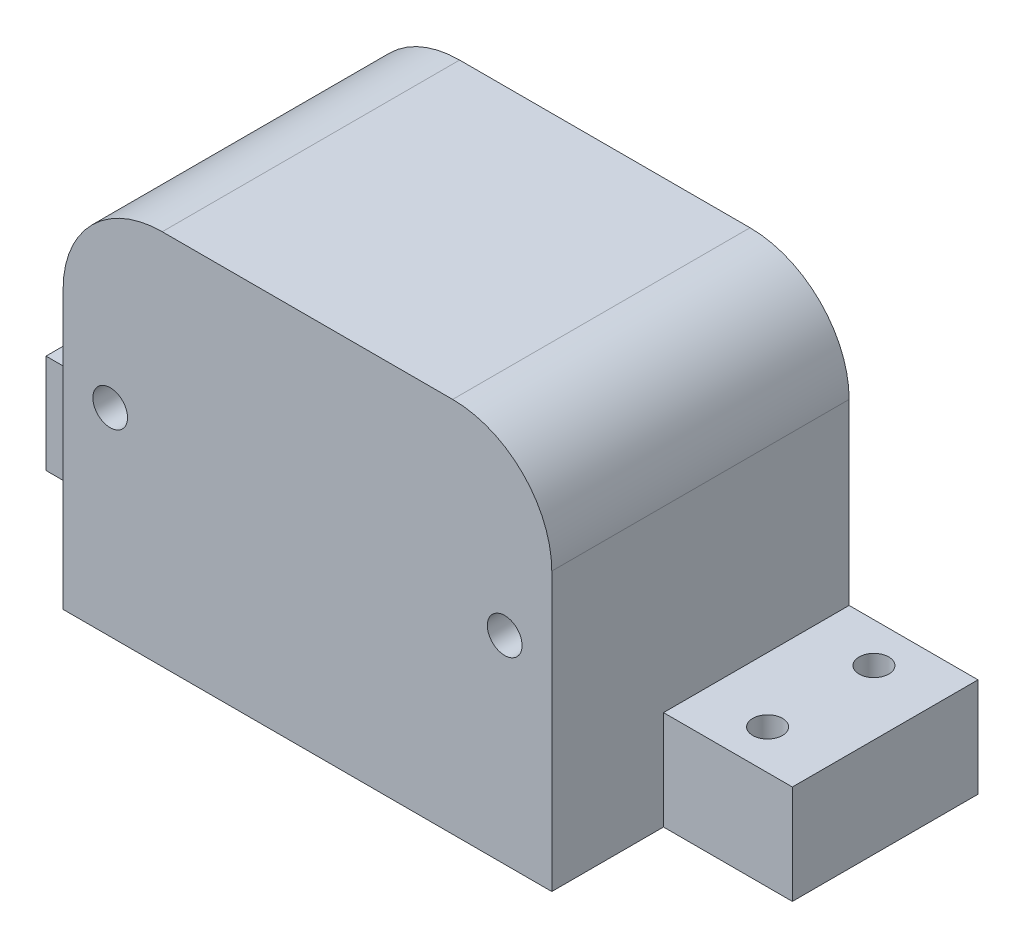
ISO-10303-21;
HEADER;
FILE_DESCRIPTION(('STEP AP214'),'2;1');
FILE_NAME('part.step','',(''),(''),'','','');
FILE_SCHEMA(('AUTOMOTIVE_DESIGN { 1 0 10303 214 1 1 1 1 }'));
ENDSEC;
DATA;
#1=APPLICATION_CONTEXT('core data for automotive mechanical design processes');
#2=APPLICATION_PROTOCOL_DEFINITION('international standard','automotive_design',2000,#1);
#3=PRODUCT_CONTEXT('',#1,'mechanical');
#4=PRODUCT('Part','Part','',(#3));
#5=PRODUCT_RELATED_PRODUCT_CATEGORY('part','',(#4));
#6=PRODUCT_DEFINITION_FORMATION('','',#4);
#7=PRODUCT_DEFINITION_CONTEXT('part definition',#1,'design');
#8=PRODUCT_DEFINITION('design','',#6,#7);
#9=PRODUCT_DEFINITION_SHAPE('','',#8);
#10=(LENGTH_UNIT() NAMED_UNIT(*) SI_UNIT(.MILLI.,.METRE.));
#11=(NAMED_UNIT(*) PLANE_ANGLE_UNIT() SI_UNIT($,.RADIAN.));
#12=(NAMED_UNIT(*) SI_UNIT($,.STERADIAN.) SOLID_ANGLE_UNIT());
#13=UNCERTAINTY_MEASURE_WITH_UNIT(LENGTH_MEASURE(1.E-05),#10,'distance_accuracy_value','');
#14=(GEOMETRIC_REPRESENTATION_CONTEXT(3) GLOBAL_UNCERTAINTY_ASSIGNED_CONTEXT((#13)) GLOBAL_UNIT_ASSIGNED_CONTEXT((#10,
#11,#12)) REPRESENTATION_CONTEXT('',''));
#15=CARTESIAN_POINT('',(0.,0.,0.));
#16=DIRECTION('',(0.,0.,1.));
#17=DIRECTION('',(1.,0.,0.));
#18=AXIS2_PLACEMENT_3D('',#15,#16,#17);
#19=CARTESIAN_POINT('',(0.,-19.,30.));
#20=DIRECTION('',(0.,1.,0.));
#21=DIRECTION('',(0.,0.,1.));
#22=AXIS2_PLACEMENT_3D('',#19,#20,#21);
#23=PLANE('',#22);
#24=CARTESIAN_POINT('',(31.15,-19.,3.99999999999999));
#25=DIRECTION('',(0.,1.,0.));
#26=DIRECTION('',(0.,0.,1.));
#27=AXIS2_PLACEMENT_3D('',#24,#25,#26);
#28=CIRCLE('',#27,1.49999999999999);
#29=CARTESIAN_POINT('',(31.15,-19.,5.49999999999998));
#30=VERTEX_POINT('',#29);
#31=EDGE_CURVE('E243',#30,#30,#28,.T.);
#32=ORIENTED_EDGE('',*,*,#31,.T.);
#33=EDGE_LOOP('',(#32));
#34=FACE_BOUND('',#33,.T.);
#35=CARTESIAN_POINT('',(31.15,-19.,14.7279854884588));
#36=DIRECTION('',(0.,1.,0.));
#37=DIRECTION('',(0.,0.,1.));
#38=AXIS2_PLACEMENT_3D('',#35,#36,#37);
#39=CIRCLE('',#38,1.5);
#40=CARTESIAN_POINT('',(31.15,-19.,16.2279854884588));
#41=VERTEX_POINT('',#40);
#42=EDGE_CURVE('E256',#41,#41,#39,.T.);
#43=ORIENTED_EDGE('',*,*,#42,.T.);
#44=EDGE_LOOP('',(#43));
#45=FACE_BOUND('',#44,.T.);
#46=CARTESIAN_POINT('',(-31.15,-19.,14.7279854884588));
#47=DIRECTION('',(0.,1.,0.));
#48=DIRECTION('',(0.,0.,1.));
#49=AXIS2_PLACEMENT_3D('',#46,#47,#48);
#50=CIRCLE('',#49,1.5);
#51=CARTESIAN_POINT('',(-31.15,-19.,16.2279854884588));
#52=VERTEX_POINT('',#51);
#53=EDGE_CURVE('E259',#52,#52,#50,.T.);
#54=ORIENTED_EDGE('',*,*,#53,.T.);
#55=EDGE_LOOP('',(#54));
#56=FACE_BOUND('',#55,.T.);
#57=CARTESIAN_POINT('',(-31.15,-19.,4.));
#58=DIRECTION('',(0.,1.,0.));
#59=DIRECTION('',(0.,0.,1.));
#60=AXIS2_PLACEMENT_3D('',#57,#58,#59);
#61=CIRCLE('',#60,1.5);
#62=CARTESIAN_POINT('',(-31.15,-19.,5.5));
#63=VERTEX_POINT('',#62);
#64=EDGE_CURVE('E262',#63,#63,#61,.T.);
#65=ORIENTED_EDGE('',*,*,#64,.T.);
#66=EDGE_LOOP('',(#65));
#67=FACE_BOUND('',#66,.T.);
#68=DIRECTION('',(-1.,0.,0.));
#69=VECTOR('',#68,1.);
#70=CARTESIAN_POINT('',(0.,-19.,18.7279854884588));
#71=LINE('',#70,#69);
#72=CARTESIAN_POINT('',(37.65,-19.,18.7279854884588));
#73=VERTEX_POINT('',#72);
#74=CARTESIAN_POINT('',(24.65,-19.,18.7279854884588));
#75=VERTEX_POINT('',#74);
#76=EDGE_CURVE('E241',#73,#75,#71,.T.);
#77=ORIENTED_EDGE('',*,*,#76,.T.);
#78=DIRECTION('',(0.,0.,1.));
#79=VECTOR('',#78,1.);
#80=CARTESIAN_POINT('',(24.65,-19.,30.));
#81=LINE('',#80,#79);
#82=CARTESIAN_POINT('',(24.65,-19.,30.));
#83=VERTEX_POINT('',#82);
#84=EDGE_CURVE('E136',#75,#83,#81,.T.);
#85=ORIENTED_EDGE('',*,*,#84,.T.);
#86=DIRECTION('',(1.,0.,0.));
#87=VECTOR('',#86,1.);
#88=CARTESIAN_POINT('',(0.,-19.,30.));
#89=LINE('',#88,#87);
#90=CARTESIAN_POINT('',(-24.65,-19.,30.));
#91=VERTEX_POINT('',#90);
#92=EDGE_CURVE('E218',#91,#83,#89,.T.);
#93=ORIENTED_EDGE('',*,*,#92,.F.);
#94=DIRECTION('',(0.,0.,-1.));
#95=VECTOR('',#94,1.);
#96=CARTESIAN_POINT('',(-24.65,-19.,30.));
#97=LINE('',#96,#95);
#98=CARTESIAN_POINT('',(-24.65,-19.,18.7279854884588));
#99=VERTEX_POINT('',#98);
#100=EDGE_CURVE('E269',#91,#99,#97,.T.);
#101=ORIENTED_EDGE('',*,*,#100,.T.);
#102=DIRECTION('',(-1.,0.,0.));
#103=VECTOR('',#102,1.);
#104=CARTESIAN_POINT('',(0.,-19.,18.7279854884588));
#105=LINE('',#104,#103);
#106=CARTESIAN_POINT('',(-37.65,-19.,18.7279854884588));
#107=VERTEX_POINT('',#106);
#108=EDGE_CURVE('E265',#99,#107,#105,.T.);
#109=ORIENTED_EDGE('',*,*,#108,.T.);
#110=DIRECTION('',(0.,0.,-1.));
#111=VECTOR('',#110,1.);
#112=CARTESIAN_POINT('',(-37.65,-19.,30.));
#113=LINE('',#112,#111);
#114=CARTESIAN_POINT('',(-37.65,-19.,0.));
#115=VERTEX_POINT('',#114);
#116=EDGE_CURVE('E219',#107,#115,#113,.T.);
#117=ORIENTED_EDGE('',*,*,#116,.T.);
#118=DIRECTION('',(1.,0.,0.));
#119=VECTOR('',#118,1.);
#120=CARTESIAN_POINT('',(0.,-19.,0.));
#121=LINE('',#120,#119);
#122=CARTESIAN_POINT('',(37.65,-19.,0.));
#123=VERTEX_POINT('',#122);
#124=EDGE_CURVE('E237',#115,#123,#121,.T.);
#125=ORIENTED_EDGE('',*,*,#124,.T.);
#126=DIRECTION('',(0.,0.,-1.));
#127=VECTOR('',#126,1.);
#128=CARTESIAN_POINT('',(37.65,-19.,30.));
#129=LINE('',#128,#127);
#130=EDGE_CURVE('E157',#73,#123,#129,.T.);
#131=ORIENTED_EDGE('',*,*,#130,.F.);
#132=EDGE_LOOP('',(#77,#85,#93,#101,#109,#117,#125,#131));
#133=FACE_BOUND('',#132,.T.);
#134=ADVANCED_FACE('F40',(#34,#45,#56,#67,#133),#23,.F.);
#135=CARTESIAN_POINT('',(37.65,0.,30.));
#136=DIRECTION('',(1.,0.,0.));
#137=DIRECTION('',(0.,0.,-1.));
#138=AXIS2_PLACEMENT_3D('',#135,#136,#137);
#139=PLANE('',#138);
#140=DIRECTION('',(0.,1.,0.));
#141=VECTOR('',#140,1.);
#142=CARTESIAN_POINT('',(37.65,-29.,18.7279854884588));
#143=LINE('',#142,#141);
#144=CARTESIAN_POINT('',(37.65,-9.,18.7279854884588));
#145=VERTEX_POINT('',#144);
#146=EDGE_CURVE('E139',#73,#145,#143,.T.);
#147=ORIENTED_EDGE('',*,*,#146,.F.);
#148=ORIENTED_EDGE('',*,*,#130,.T.);
#149=DIRECTION('',(0.,-1.,0.));
#150=VECTOR('',#149,1.);
#151=CARTESIAN_POINT('',(37.65,0.,0.));
#152=LINE('',#151,#150);
#153=CARTESIAN_POINT('',(37.65,-9.00000000000001,0.));
#154=VERTEX_POINT('',#153);
#155=EDGE_CURVE('E200',#154,#123,#152,.T.);
#156=ORIENTED_EDGE('',*,*,#155,.F.);
#157=DIRECTION('',(0.,0.,-1.));
#158=VECTOR('',#157,1.);
#159=CARTESIAN_POINT('',(37.65,-9.00000000000001,30.));
#160=LINE('',#159,#158);
#161=EDGE_CURVE('E154',#145,#154,#160,.T.);
#162=ORIENTED_EDGE('',*,*,#161,.F.);
#163=EDGE_LOOP('',(#147,#148,#156,#162));
#164=FACE_BOUND('',#163,.T.);
#165=ADVANCED_FACE('F309',(#164),#139,.T.);
#166=CARTESIAN_POINT('',(0.,-9.,30.));
#167=DIRECTION('',(0.,1.,0.));
#168=DIRECTION('',(-1.,0.,0.));
#169=AXIS2_PLACEMENT_3D('',#166,#167,#168);
#170=PLANE('',#169);
#171=DIRECTION('',(-1.,0.,0.));
#172=VECTOR('',#171,1.);
#173=CARTESIAN_POINT('',(24.65,-9.,18.7279854884588));
#174=LINE('',#173,#172);
#175=CARTESIAN_POINT('',(24.65,-9.,18.7279854884588));
#176=VERTEX_POINT('',#175);
#177=EDGE_CURVE('E142',#145,#176,#174,.T.);
#178=ORIENTED_EDGE('',*,*,#177,.F.);
#179=ORIENTED_EDGE('',*,*,#161,.T.);
#180=DIRECTION('',(1.,0.,0.));
#181=VECTOR('',#180,1.);
#182=CARTESIAN_POINT('',(0.,-9.,0.));
#183=LINE('',#182,#181);
#184=CARTESIAN_POINT('',(24.65,-9.00000000000001,0.));
#185=VERTEX_POINT('',#184);
#186=EDGE_CURVE('E153',#185,#154,#183,.T.);
#187=ORIENTED_EDGE('',*,*,#186,.F.);
#188=DIRECTION('',(0.,0.,-1.));
#189=VECTOR('',#188,1.);
#190=CARTESIAN_POINT('',(24.65,-9.00000000000001,30.));
#191=LINE('',#190,#189);
#192=EDGE_CURVE('E133',#176,#185,#191,.T.);
#193=ORIENTED_EDGE('',*,*,#192,.F.);
#194=EDGE_LOOP('',(#178,#179,#187,#193));
#195=FACE_BOUND('',#194,.T.);
#196=CARTESIAN_POINT('',(31.15,-9.,3.99999999999999));
#197=DIRECTION('',(0.,1.,0.));
#198=DIRECTION('',(1.,0.,0.));
#199=AXIS2_PLACEMENT_3D('',#196,#197,#198);
#200=CIRCLE('',#199,1.49999999999999);
#201=CARTESIAN_POINT('',(32.65,-9.,3.99999999999999));
#202=VERTEX_POINT('',#201);
#203=EDGE_CURVE('E147',#202,#202,#200,.T.);
#204=ORIENTED_EDGE('',*,*,#203,.F.);
#205=EDGE_LOOP('',(#204));
#206=FACE_BOUND('',#205,.T.);
#207=CARTESIAN_POINT('',(31.15,-9.,14.7279854884588));
#208=DIRECTION('',(0.,1.,0.));
#209=DIRECTION('',(1.,0.,0.));
#210=AXIS2_PLACEMENT_3D('',#207,#208,#209);
#211=CIRCLE('',#210,1.5);
#212=CARTESIAN_POINT('',(32.65,-9.,14.7279854884588));
#213=VERTEX_POINT('',#212);
#214=EDGE_CURVE('E281',#213,#213,#211,.T.);
#215=ORIENTED_EDGE('',*,*,#214,.F.);
#216=EDGE_LOOP('',(#215));
#217=FACE_BOUND('',#216,.T.);
#218=ADVANCED_FACE('F150',(#195,#206,#217),#170,.T.);
#219=CARTESIAN_POINT('',(24.65,0.,30.));
#220=DIRECTION('',(-1.,0.,0.));
#221=DIRECTION('',(0.,0.,1.));
#222=AXIS2_PLACEMENT_3D('',#219,#220,#221);
#223=PLANE('',#222);
#224=DIRECTION('',(0.,1.,0.));
#225=VECTOR('',#224,1.);
#226=CARTESIAN_POINT('',(24.65,0.,0.));
#227=LINE('',#226,#225);
#228=CARTESIAN_POINT('',(24.65,9.,0.));
#229=VERTEX_POINT('',#228);
#230=EDGE_CURVE('E195',#185,#229,#227,.T.);
#231=ORIENTED_EDGE('',*,*,#230,.T.);
#232=DIRECTION('',(0.,0.,-1.));
#233=VECTOR('',#232,1.);
#234=CARTESIAN_POINT('',(24.65,9.,30.));
#235=LINE('',#234,#233);
#236=CARTESIAN_POINT('',(24.65,9.,30.));
#237=VERTEX_POINT('',#236);
#238=EDGE_CURVE('E173',#229,#237,#235,.F.);
#239=ORIENTED_EDGE('',*,*,#238,.T.);
#240=DIRECTION('',(0.,1.,0.));
#241=VECTOR('',#240,1.);
#242=CARTESIAN_POINT('',(24.65,0.,30.));
#243=LINE('',#242,#241);
#244=EDGE_CURVE('E181',#83,#237,#243,.T.);
#245=ORIENTED_EDGE('',*,*,#244,.F.);
#246=ORIENTED_EDGE('',*,*,#84,.F.);
#247=DIRECTION('',(0.,1.,0.));
#248=VECTOR('',#247,1.);
#249=CARTESIAN_POINT('',(24.65,-29.,18.7279854884588));
#250=LINE('',#249,#248);
#251=EDGE_CURVE('E128',#75,#176,#250,.T.);
#252=ORIENTED_EDGE('',*,*,#251,.T.);
#253=ORIENTED_EDGE('',*,*,#192,.T.);
#254=EDGE_LOOP('',(#231,#239,#245,#246,#252,#253));
#255=FACE_BOUND('',#254,.T.);
#256=ADVANCED_FACE('F131',(#255),#223,.F.);
#257=CARTESIAN_POINT('',(0.,19.,30.));
#258=DIRECTION('',(0.,1.,0.));
#259=DIRECTION('',(0.,0.,1.));
#260=AXIS2_PLACEMENT_3D('',#257,#258,#259);
#261=PLANE('',#260);
#262=DIRECTION('',(1.,0.,0.));
#263=VECTOR('',#262,1.);
#264=CARTESIAN_POINT('',(0.,19.,30.));
#265=LINE('',#264,#263);
#266=CARTESIAN_POINT('',(-14.65,19.,30.));
#267=VERTEX_POINT('',#266);
#268=CARTESIAN_POINT('',(14.65,19.,30.));
#269=VERTEX_POINT('',#268);
#270=EDGE_CURVE('E180',#267,#269,#265,.T.);
#271=ORIENTED_EDGE('',*,*,#270,.T.);
#272=DIRECTION('',(0.,0.,-1.));
#273=VECTOR('',#272,1.);
#274=CARTESIAN_POINT('',(14.65,19.,0.));
#275=LINE('',#274,#273);
#276=CARTESIAN_POINT('',(14.65,19.,0.));
#277=VERTEX_POINT('',#276);
#278=EDGE_CURVE('E166',#269,#277,#275,.T.);
#279=ORIENTED_EDGE('',*,*,#278,.T.);
#280=DIRECTION('',(1.,0.,0.));
#281=VECTOR('',#280,1.);
#282=CARTESIAN_POINT('',(0.,19.,0.));
#283=LINE('',#282,#281);
#284=CARTESIAN_POINT('',(-14.65,19.,0.));
#285=VERTEX_POINT('',#284);
#286=EDGE_CURVE('E196',#285,#277,#283,.T.);
#287=ORIENTED_EDGE('',*,*,#286,.F.);
#288=DIRECTION('',(0.,0.,-1.));
#289=VECTOR('',#288,1.);
#290=CARTESIAN_POINT('',(-14.65,19.,30.));
#291=LINE('',#290,#289);
#292=EDGE_CURVE('E164',#285,#267,#291,.F.);
#293=ORIENTED_EDGE('',*,*,#292,.T.);
#294=EDGE_LOOP('',(#271,#279,#287,#293));
#295=FACE_BOUND('',#294,.T.);
#296=ADVANCED_FACE('F186',(#295),#261,.T.);
#297=CARTESIAN_POINT('',(-24.65,0.,30.));
#298=DIRECTION('',(-1.,0.,0.));
#299=DIRECTION('',(0.,0.,1.));
#300=AXIS2_PLACEMENT_3D('',#297,#298,#299);
#301=PLANE('',#300);
#302=DIRECTION('',(0.,1.,0.));
#303=VECTOR('',#302,1.);
#304=CARTESIAN_POINT('',(-24.65,0.,30.));
#305=LINE('',#304,#303);
#306=CARTESIAN_POINT('',(-24.65,9.,30.));
#307=VERTEX_POINT('',#306);
#308=EDGE_CURVE('E55',#91,#307,#305,.T.);
#309=ORIENTED_EDGE('',*,*,#308,.T.);
#310=DIRECTION('',(0.,0.,-1.));
#311=VECTOR('',#310,1.);
#312=CARTESIAN_POINT('',(-24.65,9.,30.));
#313=LINE('',#312,#311);
#314=CARTESIAN_POINT('',(-24.65,9.,0.));
#315=VERTEX_POINT('',#314);
#316=EDGE_CURVE('E11',#307,#315,#313,.T.);
#317=ORIENTED_EDGE('',*,*,#316,.T.);
#318=DIRECTION('',(0.,1.,0.));
#319=VECTOR('',#318,1.);
#320=CARTESIAN_POINT('',(-24.65,0.,0.));
#321=LINE('',#320,#319);
#322=CARTESIAN_POINT('',(-24.65,-9.00000000000001,0.));
#323=VERTEX_POINT('',#322);
#324=EDGE_CURVE('E198',#323,#315,#321,.T.);
#325=ORIENTED_EDGE('',*,*,#324,.F.);
#326=DIRECTION('',(0.,0.,-1.));
#327=VECTOR('',#326,1.);
#328=CARTESIAN_POINT('',(-24.65,-9.00000000000001,30.));
#329=LINE('',#328,#327);
#330=CARTESIAN_POINT('',(-24.65,-9.00000000000001,18.7279854884588));
#331=VERTEX_POINT('',#330);
#332=EDGE_CURVE('E155',#331,#323,#329,.T.);
#333=ORIENTED_EDGE('',*,*,#332,.F.);
#334=DIRECTION('',(0.,1.,0.));
#335=VECTOR('',#334,1.);
#336=CARTESIAN_POINT('',(-24.65,-29.,18.7279854884588));
#337=LINE('',#336,#335);
#338=EDGE_CURVE('E272',#99,#331,#337,.T.);
#339=ORIENTED_EDGE('',*,*,#338,.F.);
#340=ORIENTED_EDGE('',*,*,#100,.F.);
#341=EDGE_LOOP('',(#309,#317,#325,#333,#339,#340));
#342=FACE_BOUND('',#341,.T.);
#343=ADVANCED_FACE('F295',(#342),#301,.T.);
#344=CARTESIAN_POINT('',(0.,-9.,30.));
#345=DIRECTION('',(0.,-1.,0.));
#346=DIRECTION('',(1.,0.,0.));
#347=AXIS2_PLACEMENT_3D('',#344,#345,#346);
#348=PLANE('',#347);
#349=CARTESIAN_POINT('',(-31.15,-9.00000000000001,14.7279854884588));
#350=DIRECTION('',(0.,1.,0.));
#351=DIRECTION('',(-1.,0.,0.));
#352=AXIS2_PLACEMENT_3D('',#349,#350,#351);
#353=CIRCLE('',#352,1.5);
#354=CARTESIAN_POINT('',(-32.65,-9.00000000000001,14.7279854884588));
#355=VERTEX_POINT('',#354);
#356=EDGE_CURVE('E284',#355,#355,#353,.T.);
#357=ORIENTED_EDGE('',*,*,#356,.F.);
#358=EDGE_LOOP('',(#357));
#359=FACE_BOUND('',#358,.T.);
#360=CARTESIAN_POINT('',(-31.15,-9.00000000000001,4.));
#361=DIRECTION('',(0.,1.,0.));
#362=DIRECTION('',(-1.,0.,0.));
#363=AXIS2_PLACEMENT_3D('',#360,#361,#362);
#364=CIRCLE('',#363,1.5);
#365=CARTESIAN_POINT('',(-32.65,-9.00000000000001,4.));
#366=VERTEX_POINT('',#365);
#367=EDGE_CURVE('E276',#366,#366,#364,.T.);
#368=ORIENTED_EDGE('',*,*,#367,.F.);
#369=EDGE_LOOP('',(#368));
#370=FACE_BOUND('',#369,.T.);
#371=DIRECTION('',(0.,0.,-1.));
#372=VECTOR('',#371,1.);
#373=CARTESIAN_POINT('',(-37.65,-9.00000000000001,30.));
#374=LINE('',#373,#372);
#375=CARTESIAN_POINT('',(-37.65,-9.00000000000001,18.7279854884588));
#376=VERTEX_POINT('',#375);
#377=CARTESIAN_POINT('',(-37.65,-9.00000000000001,0.));
#378=VERTEX_POINT('',#377);
#379=EDGE_CURVE('E159',#376,#378,#374,.T.);
#380=ORIENTED_EDGE('',*,*,#379,.F.);
#381=DIRECTION('',(-1.,0.,0.));
#382=VECTOR('',#381,1.);
#383=CARTESIAN_POINT('',(-24.65,-9.00000000000001,18.7279854884588));
#384=LINE('',#383,#382);
#385=EDGE_CURVE('E274',#331,#376,#384,.T.);
#386=ORIENTED_EDGE('',*,*,#385,.F.);
#387=ORIENTED_EDGE('',*,*,#332,.T.);
#388=DIRECTION('',(-1.,0.,0.));
#389=VECTOR('',#388,1.);
#390=CARTESIAN_POINT('',(0.,-9.,0.));
#391=LINE('',#390,#389);
#392=EDGE_CURVE('E206',#323,#378,#391,.T.);
#393=ORIENTED_EDGE('',*,*,#392,.T.);
#394=EDGE_LOOP('',(#380,#386,#387,#393));
#395=FACE_BOUND('',#394,.T.);
#396=ADVANCED_FACE('F232',(#359,#370,#395),#348,.F.);
#397=CARTESIAN_POINT('',(-19.9,1.,30.));
#398=DIRECTION('',(0.,0.,-1.));
#399=DIRECTION('',(-1.,0.,0.));
#400=AXIS2_PLACEMENT_3D('',#397,#398,#399);
#401=CYLINDRICAL_SURFACE('',#400,1.75);
#402=CARTESIAN_POINT('',(-19.9,1.,30.));
#403=DIRECTION('',(0.,0.,1.));
#404=DIRECTION('',(1.,0.,0.));
#405=AXIS2_PLACEMENT_3D('',#402,#403,#404);
#406=CIRCLE('',#405,1.75);
#407=CARTESIAN_POINT('',(-18.15,1.,30.));
#408=VERTEX_POINT('',#407);
#409=EDGE_CURVE('E248',#408,#408,#406,.T.);
#410=ORIENTED_EDGE('',*,*,#409,.T.);
#411=EDGE_LOOP('',(#410));
#412=FACE_BOUND('',#411,.T.);
#413=CARTESIAN_POINT('',(-19.9,1.,0.));
#414=DIRECTION('',(0.,0.,1.));
#415=DIRECTION('',(1.,0.,0.));
#416=AXIS2_PLACEMENT_3D('',#413,#414,#415);
#417=CIRCLE('',#416,1.75);
#418=CARTESIAN_POINT('',(-18.15,1.,0.));
#419=VERTEX_POINT('',#418);
#420=EDGE_CURVE('E212',#419,#419,#417,.T.);
#421=ORIENTED_EDGE('',*,*,#420,.F.);
#422=EDGE_LOOP('',(#421));
#423=FACE_BOUND('',#422,.T.);
#424=ADVANCED_FACE('F294',(#412,#423),#401,.F.);
#425=CARTESIAN_POINT('',(-37.65,0.,30.));
#426=DIRECTION('',(1.,0.,0.));
#427=DIRECTION('',(0.,0.,-1.));
#428=AXIS2_PLACEMENT_3D('',#425,#426,#427);
#429=PLANE('',#428);
#430=ORIENTED_EDGE('',*,*,#116,.F.);
#431=DIRECTION('',(0.,1.,0.));
#432=VECTOR('',#431,1.);
#433=CARTESIAN_POINT('',(-37.65,-29.,18.7279854884588));
#434=LINE('',#433,#432);
#435=EDGE_CURVE('E228',#107,#376,#434,.T.);
#436=ORIENTED_EDGE('',*,*,#435,.T.);
#437=ORIENTED_EDGE('',*,*,#379,.T.);
#438=DIRECTION('',(0.,-1.,0.));
#439=VECTOR('',#438,1.);
#440=CARTESIAN_POINT('',(-37.65,0.,0.));
#441=LINE('',#440,#439);
#442=EDGE_CURVE('E209',#378,#115,#441,.T.);
#443=ORIENTED_EDGE('',*,*,#442,.T.);
#444=EDGE_LOOP('',(#430,#436,#437,#443));
#445=FACE_BOUND('',#444,.T.);
#446=ADVANCED_FACE('F225',(#445),#429,.F.);
#447=CARTESIAN_POINT('',(19.9,1.,30.));
#448=DIRECTION('',(0.,0.,-1.));
#449=DIRECTION('',(-1.,0.,0.));
#450=AXIS2_PLACEMENT_3D('',#447,#448,#449);
#451=CYLINDRICAL_SURFACE('',#450,1.75);
#452=CARTESIAN_POINT('',(19.9,1.,30.));
#453=DIRECTION('',(0.,0.,1.));
#454=DIRECTION('',(1.,0.,0.));
#455=AXIS2_PLACEMENT_3D('',#452,#453,#454);
#456=CIRCLE('',#455,1.75);
#457=CARTESIAN_POINT('',(21.65,1.,30.));
#458=VERTEX_POINT('',#457);
#459=EDGE_CURVE('E220',#458,#458,#456,.F.);
#460=ORIENTED_EDGE('',*,*,#459,.F.);
#461=EDGE_LOOP('',(#460));
#462=FACE_BOUND('',#461,.T.);
#463=CARTESIAN_POINT('',(19.9,1.,0.));
#464=DIRECTION('',(0.,0.,1.));
#465=DIRECTION('',(1.,0.,0.));
#466=AXIS2_PLACEMENT_3D('',#463,#464,#465);
#467=CIRCLE('',#466,1.75);
#468=CARTESIAN_POINT('',(21.65,1.,0.));
#469=VERTEX_POINT('',#468);
#470=EDGE_CURVE('E215',#469,#469,#467,.F.);
#471=ORIENTED_EDGE('',*,*,#470,.T.);
#472=EDGE_LOOP('',(#471));
#473=FACE_BOUND('',#472,.T.);
#474=ADVANCED_FACE('F330',(#462,#473),#451,.F.);
#475=CARTESIAN_POINT('',(0.,0.,30.));
#476=DIRECTION('',(0.,0.,1.));
#477=DIRECTION('',(1.,0.,0.));
#478=AXIS2_PLACEMENT_3D('',#475,#476,#477);
#479=PLANE('',#478);
#480=ORIENTED_EDGE('',*,*,#92,.T.);
#481=ORIENTED_EDGE('',*,*,#244,.T.);
#482=CARTESIAN_POINT('',(14.65,9.,30.));
#483=DIRECTION('',(0.,0.,1.));
#484=DIRECTION('',(1.,0.,0.));
#485=AXIS2_PLACEMENT_3D('',#482,#483,#484);
#486=CIRCLE('',#485,10.);
#487=EDGE_CURVE('E48',#237,#269,#486,.T.);
#488=ORIENTED_EDGE('',*,*,#487,.T.);
#489=ORIENTED_EDGE('',*,*,#270,.F.);
#490=CARTESIAN_POINT('',(-14.65,9.,30.));
#491=DIRECTION('',(0.,0.,1.));
#492=DIRECTION('',(1.,0.,0.));
#493=AXIS2_PLACEMENT_3D('',#490,#491,#492);
#494=CIRCLE('',#493,10.);
#495=EDGE_CURVE('E60',#267,#307,#494,.T.);
#496=ORIENTED_EDGE('',*,*,#495,.T.);
#497=ORIENTED_EDGE('',*,*,#308,.F.);
#498=EDGE_LOOP('',(#480,#481,#488,#489,#496,#497));
#499=FACE_BOUND('',#498,.T.);
#500=ORIENTED_EDGE('',*,*,#409,.F.);
#501=EDGE_LOOP('',(#500));
#502=FACE_BOUND('',#501,.T.);
#503=ORIENTED_EDGE('',*,*,#459,.T.);
#504=EDGE_LOOP('',(#503));
#505=FACE_BOUND('',#504,.T.);
#506=ADVANCED_FACE('F178',(#499,#502,#505),#479,.T.);
#507=CARTESIAN_POINT('',(0.,0.,0.));
#508=DIRECTION('',(0.,0.,1.));
#509=DIRECTION('',(1.,0.,0.));
#510=AXIS2_PLACEMENT_3D('',#507,#508,#509);
#511=PLANE('',#510);
#512=ORIENTED_EDGE('',*,*,#286,.T.);
#513=CARTESIAN_POINT('',(14.65,9.,0.));
#514=DIRECTION('',(0.,0.,1.));
#515=DIRECTION('',(1.,0.,0.));
#516=AXIS2_PLACEMENT_3D('',#513,#514,#515);
#517=CIRCLE('',#516,10.);
#518=EDGE_CURVE('E171',#277,#229,#517,.F.);
#519=ORIENTED_EDGE('',*,*,#518,.T.);
#520=ORIENTED_EDGE('',*,*,#230,.F.);
#521=ORIENTED_EDGE('',*,*,#186,.T.);
#522=ORIENTED_EDGE('',*,*,#155,.T.);
#523=ORIENTED_EDGE('',*,*,#124,.F.);
#524=ORIENTED_EDGE('',*,*,#442,.F.);
#525=ORIENTED_EDGE('',*,*,#392,.F.);
#526=ORIENTED_EDGE('',*,*,#324,.T.);
#527=CARTESIAN_POINT('',(-14.65,9.,0.));
#528=DIRECTION('',(0.,0.,1.));
#529=DIRECTION('',(1.,0.,0.));
#530=AXIS2_PLACEMENT_3D('',#527,#528,#529);
#531=CIRCLE('',#530,10.);
#532=EDGE_CURVE('E169',#315,#285,#531,.F.);
#533=ORIENTED_EDGE('',*,*,#532,.T.);
#534=EDGE_LOOP('',(#512,#519,#520,#521,#522,#523,#524,#525,#526,#533));
#535=FACE_BOUND('',#534,.T.);
#536=ORIENTED_EDGE('',*,*,#420,.T.);
#537=EDGE_LOOP('',(#536));
#538=FACE_BOUND('',#537,.T.);
#539=ORIENTED_EDGE('',*,*,#470,.F.);
#540=EDGE_LOOP('',(#539));
#541=FACE_BOUND('',#540,.T.);
#542=ADVANCED_FACE('F193',(#535,#538,#541),#511,.F.);
#543=CARTESIAN_POINT('',(14.65,9.,30.));
#544=DIRECTION('',(0.,0.,1.));
#545=DIRECTION('',(1.,0.,0.));
#546=AXIS2_PLACEMENT_3D('',#543,#544,#545);
#547=CYLINDRICAL_SURFACE('',#546,10.);
#548=ORIENTED_EDGE('',*,*,#487,.F.);
#549=ORIENTED_EDGE('',*,*,#238,.F.);
#550=ORIENTED_EDGE('',*,*,#518,.F.);
#551=ORIENTED_EDGE('',*,*,#278,.F.);
#552=EDGE_LOOP('',(#548,#549,#550,#551));
#553=FACE_BOUND('',#552,.T.);
#554=ADVANCED_FACE('F191',(#553),#547,.T.);
#555=CARTESIAN_POINT('',(-14.65,9.,30.));
#556=DIRECTION('',(0.,0.,-1.));
#557=DIRECTION('',(-1.,0.,0.));
#558=AXIS2_PLACEMENT_3D('',#555,#556,#557);
#559=CYLINDRICAL_SURFACE('',#558,10.);
#560=ORIENTED_EDGE('',*,*,#495,.F.);
#561=ORIENTED_EDGE('',*,*,#292,.F.);
#562=ORIENTED_EDGE('',*,*,#532,.F.);
#563=ORIENTED_EDGE('',*,*,#316,.F.);
#564=EDGE_LOOP('',(#560,#561,#562,#563));
#565=FACE_BOUND('',#564,.T.);
#566=ADVANCED_FACE('F42',(#565),#559,.T.);
#567=CARTESIAN_POINT('',(-24.65,-29.,18.7279854884588));
#568=DIRECTION('',(0.,0.,-1.));
#569=DIRECTION('',(-1.,0.,0.));
#570=AXIS2_PLACEMENT_3D('',#567,#568,#569);
#571=PLANE('',#570);
#572=ORIENTED_EDGE('',*,*,#338,.T.);
#573=ORIENTED_EDGE('',*,*,#385,.T.);
#574=ORIENTED_EDGE('',*,*,#435,.F.);
#575=ORIENTED_EDGE('',*,*,#108,.F.);
#576=EDGE_LOOP('',(#572,#573,#574,#575));
#577=FACE_BOUND('',#576,.T.);
#578=ADVANCED_FACE('F324',(#577),#571,.F.);
#579=CARTESIAN_POINT('',(24.65,-29.,18.7279854884588));
#580=DIRECTION('',(0.,0.,-1.));
#581=DIRECTION('',(-1.,0.,0.));
#582=AXIS2_PLACEMENT_3D('',#579,#580,#581);
#583=PLANE('',#582);
#584=ORIENTED_EDGE('',*,*,#146,.T.);
#585=ORIENTED_EDGE('',*,*,#177,.T.);
#586=ORIENTED_EDGE('',*,*,#251,.F.);
#587=ORIENTED_EDGE('',*,*,#76,.F.);
#588=EDGE_LOOP('',(#584,#585,#586,#587));
#589=FACE_BOUND('',#588,.T.);
#590=ADVANCED_FACE('F143',(#589),#583,.F.);
#591=CARTESIAN_POINT('',(-31.15,-29.,4.));
#592=DIRECTION('',(0.,1.,0.));
#593=DIRECTION('',(-1.,0.,0.));
#594=AXIS2_PLACEMENT_3D('',#591,#592,#593);
#595=CYLINDRICAL_SURFACE('',#594,1.5);
#596=ORIENTED_EDGE('',*,*,#367,.T.);
#597=EDGE_LOOP('',(#596));
#598=FACE_BOUND('',#597,.T.);
#599=ORIENTED_EDGE('',*,*,#64,.F.);
#600=EDGE_LOOP('',(#599));
#601=FACE_BOUND('',#600,.T.);
#602=ADVANCED_FACE('F290',(#598,#601),#595,.F.);
#603=CARTESIAN_POINT('',(-31.15,-29.,14.7279854884588));
#604=DIRECTION('',(0.,1.,0.));
#605=DIRECTION('',(-1.,0.,0.));
#606=AXIS2_PLACEMENT_3D('',#603,#604,#605);
#607=CYLINDRICAL_SURFACE('',#606,1.5);
#608=ORIENTED_EDGE('',*,*,#356,.T.);
#609=EDGE_LOOP('',(#608));
#610=FACE_BOUND('',#609,.T.);
#611=ORIENTED_EDGE('',*,*,#53,.F.);
#612=EDGE_LOOP('',(#611));
#613=FACE_BOUND('',#612,.T.);
#614=ADVANCED_FACE('F380',(#610,#613),#607,.F.);
#615=CARTESIAN_POINT('',(31.15,-29.,14.7279854884588));
#616=DIRECTION('',(0.,1.,0.));
#617=DIRECTION('',(-1.,0.,0.));
#618=AXIS2_PLACEMENT_3D('',#615,#616,#617);
#619=CYLINDRICAL_SURFACE('',#618,1.5);
#620=ORIENTED_EDGE('',*,*,#214,.T.);
#621=EDGE_LOOP('',(#620));
#622=FACE_BOUND('',#621,.T.);
#623=ORIENTED_EDGE('',*,*,#42,.F.);
#624=EDGE_LOOP('',(#623));
#625=FACE_BOUND('',#624,.T.);
#626=ADVANCED_FACE('F390',(#622,#625),#619,.F.);
#627=CARTESIAN_POINT('',(31.15,-29.,3.99999999999999));
#628=DIRECTION('',(0.,1.,0.));
#629=DIRECTION('',(-1.,0.,0.));
#630=AXIS2_PLACEMENT_3D('',#627,#628,#629);
#631=CYLINDRICAL_SURFACE('',#630,1.49999999999999);
#632=ORIENTED_EDGE('',*,*,#203,.T.);
#633=EDGE_LOOP('',(#632));
#634=FACE_BOUND('',#633,.T.);
#635=ORIENTED_EDGE('',*,*,#31,.F.);
#636=EDGE_LOOP('',(#635));
#637=FACE_BOUND('',#636,.T.);
#638=ADVANCED_FACE('F401',(#634,#637),#631,.F.);
#639=CLOSED_SHELL('',(#134,#165,#218,#256,#296,#343,#396,#424,#446,#474,#506,#542,#554,#566,
#578,#590,#602,#614,#626,#638));
#640=MANIFOLD_SOLID_BREP('B2',#639);
#641=ADVANCED_BREP_SHAPE_REPRESENTATION('',(#18,#640),#14);
#642=SHAPE_DEFINITION_REPRESENTATION(#9,#641);
ENDSEC;
END-ISO-10303-21;
